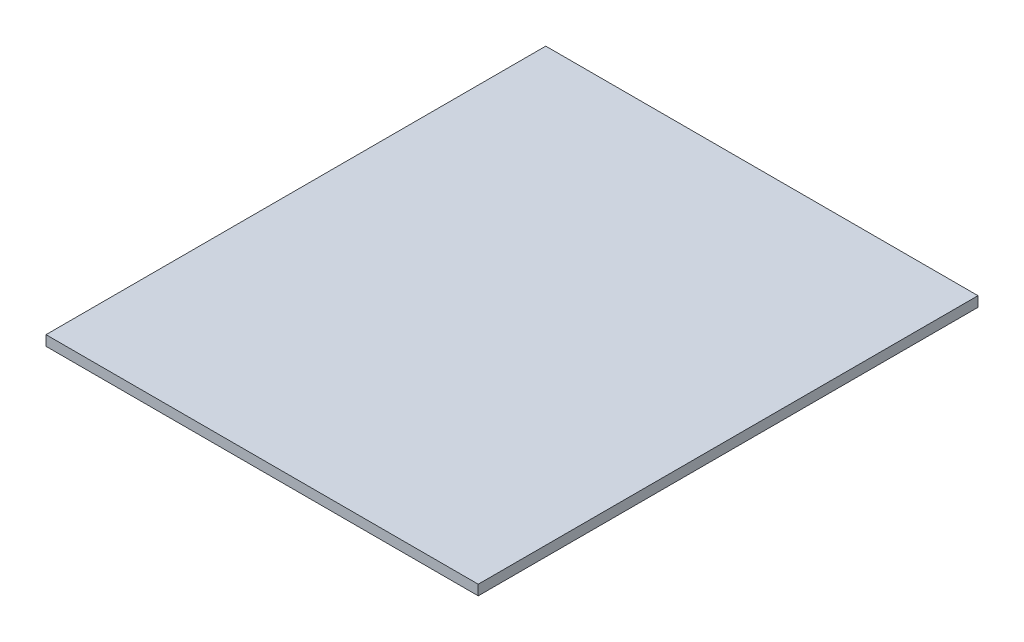
ISO-10303-21;
HEADER;
FILE_DESCRIPTION(('STEP AP214'),'2;1');
FILE_NAME('part.step','',(''),(''),'','','');
FILE_SCHEMA(('AUTOMOTIVE_DESIGN { 1 0 10303 214 1 1 1 1 }'));
ENDSEC;
DATA;
#1=APPLICATION_CONTEXT('core data for automotive mechanical design processes');
#2=APPLICATION_PROTOCOL_DEFINITION('international standard','automotive_design',2000,#1);
#3=PRODUCT_CONTEXT('',#1,'mechanical');
#4=PRODUCT('Part','Part','',(#3));
#5=PRODUCT_RELATED_PRODUCT_CATEGORY('part','',(#4));
#6=PRODUCT_DEFINITION_FORMATION('','',#4);
#7=PRODUCT_DEFINITION_CONTEXT('part definition',#1,'design');
#8=PRODUCT_DEFINITION('design','',#6,#7);
#9=PRODUCT_DEFINITION_SHAPE('','',#8);
#10=(LENGTH_UNIT() NAMED_UNIT(*) SI_UNIT(.MILLI.,.METRE.));
#11=(NAMED_UNIT(*) PLANE_ANGLE_UNIT() SI_UNIT($,.RADIAN.));
#12=(NAMED_UNIT(*) SI_UNIT($,.STERADIAN.) SOLID_ANGLE_UNIT());
#13=UNCERTAINTY_MEASURE_WITH_UNIT(LENGTH_MEASURE(1.E-05),#10,'distance_accuracy_value','');
#14=(GEOMETRIC_REPRESENTATION_CONTEXT(3) GLOBAL_UNCERTAINTY_ASSIGNED_CONTEXT((#13)) GLOBAL_UNIT_ASSIGNED_CONTEXT((#10,
#11,#12)) REPRESENTATION_CONTEXT('',''));
#15=CARTESIAN_POINT('',(0.,0.,0.));
#16=DIRECTION('',(0.,0.,1.));
#17=DIRECTION('',(1.,0.,0.));
#18=AXIS2_PLACEMENT_3D('',#15,#16,#17);
#19=CARTESIAN_POINT('',(32.,1.5,-37.));
#20=DIRECTION('',(-1.,0.,0.));
#21=DIRECTION('',(0.,0.,1.));
#22=AXIS2_PLACEMENT_3D('',#19,#20,#21);
#23=PLANE('',#22);
#24=DIRECTION('',(0.,0.,-1.));
#25=VECTOR('',#24,1.);
#26=CARTESIAN_POINT('',(32.,0.,-37.));
#27=LINE('',#26,#25);
#28=CARTESIAN_POINT('',(32.,0.,37.));
#29=VERTEX_POINT('',#28);
#30=CARTESIAN_POINT('',(32.,0.,-37.));
#31=VERTEX_POINT('',#30);
#32=EDGE_CURVE('E99',#29,#31,#27,.T.);
#33=ORIENTED_EDGE('',*,*,#32,.T.);
#34=DIRECTION('',(0.,-1.,0.));
#35=VECTOR('',#34,1.);
#36=CARTESIAN_POINT('',(32.,1.5,-37.));
#37=LINE('',#36,#35);
#38=CARTESIAN_POINT('',(32.,1.5,-37.));
#39=VERTEX_POINT('',#38);
#40=EDGE_CURVE('E11',#39,#31,#37,.T.);
#41=ORIENTED_EDGE('',*,*,#40,.F.);
#42=DIRECTION('',(0.,0.,-1.));
#43=VECTOR('',#42,1.);
#44=CARTESIAN_POINT('',(32.,1.5,-37.));
#45=LINE('',#44,#43);
#46=CARTESIAN_POINT('',(32.,1.5,37.));
#47=VERTEX_POINT('',#46);
#48=EDGE_CURVE('E87',#47,#39,#45,.T.);
#49=ORIENTED_EDGE('',*,*,#48,.F.);
#50=DIRECTION('',(0.,-1.,0.));
#51=VECTOR('',#50,1.);
#52=CARTESIAN_POINT('',(32.,1.5,37.));
#53=LINE('',#52,#51);
#54=EDGE_CURVE('E95',#47,#29,#53,.T.);
#55=ORIENTED_EDGE('',*,*,#54,.T.);
#56=EDGE_LOOP('',(#33,#41,#49,#55));
#57=FACE_BOUND('',#56,.T.);
#58=ADVANCED_FACE('F36',(#57),#23,.F.);
#59=CARTESIAN_POINT('',(-32.,1.5,-37.));
#60=DIRECTION('',(0.,0.,1.));
#61=DIRECTION('',(1.,0.,0.));
#62=AXIS2_PLACEMENT_3D('',#59,#60,#61);
#63=PLANE('',#62);
#64=DIRECTION('',(-1.,0.,0.));
#65=VECTOR('',#64,1.);
#66=CARTESIAN_POINT('',(-32.,0.,-37.));
#67=LINE('',#66,#65);
#68=CARTESIAN_POINT('',(-32.,0.,-37.));
#69=VERTEX_POINT('',#68);
#70=EDGE_CURVE('E91',#31,#69,#67,.T.);
#71=ORIENTED_EDGE('',*,*,#70,.T.);
#72=DIRECTION('',(0.,-1.,0.));
#73=VECTOR('',#72,1.);
#74=CARTESIAN_POINT('',(-32.,1.5,-37.));
#75=LINE('',#74,#73);
#76=CARTESIAN_POINT('',(-32.,1.5,-37.));
#77=VERTEX_POINT('',#76);
#78=EDGE_CURVE('E44',#77,#69,#75,.T.);
#79=ORIENTED_EDGE('',*,*,#78,.F.);
#80=DIRECTION('',(-1.,0.,0.));
#81=VECTOR('',#80,1.);
#82=CARTESIAN_POINT('',(-32.,1.5,-37.));
#83=LINE('',#82,#81);
#84=EDGE_CURVE('E82',#39,#77,#83,.T.);
#85=ORIENTED_EDGE('',*,*,#84,.F.);
#86=ORIENTED_EDGE('',*,*,#40,.T.);
#87=EDGE_LOOP('',(#71,#79,#85,#86));
#88=FACE_BOUND('',#87,.T.);
#89=ADVANCED_FACE('F90',(#88),#63,.F.);
#90=CARTESIAN_POINT('',(-32.,1.5,-37.));
#91=DIRECTION('',(1.,0.,0.));
#92=DIRECTION('',(0.,0.,-1.));
#93=AXIS2_PLACEMENT_3D('',#90,#91,#92);
#94=PLANE('',#93);
#95=DIRECTION('',(0.,0.,1.));
#96=VECTOR('',#95,1.);
#97=CARTESIAN_POINT('',(-32.,0.,-37.));
#98=LINE('',#97,#96);
#99=CARTESIAN_POINT('',(-32.,0.,37.));
#100=VERTEX_POINT('',#99);
#101=EDGE_CURVE('E69',#69,#100,#98,.T.);
#102=ORIENTED_EDGE('',*,*,#101,.T.);
#103=DIRECTION('',(0.,-1.,0.));
#104=VECTOR('',#103,1.);
#105=CARTESIAN_POINT('',(-32.,1.5,37.));
#106=LINE('',#105,#104);
#107=CARTESIAN_POINT('',(-32.,1.5,37.));
#108=VERTEX_POINT('',#107);
#109=EDGE_CURVE('E92',#108,#100,#106,.T.);
#110=ORIENTED_EDGE('',*,*,#109,.F.);
#111=DIRECTION('',(0.,0.,1.));
#112=VECTOR('',#111,1.);
#113=CARTESIAN_POINT('',(-32.,1.5,-37.));
#114=LINE('',#113,#112);
#115=EDGE_CURVE('E85',#77,#108,#114,.T.);
#116=ORIENTED_EDGE('',*,*,#115,.F.);
#117=ORIENTED_EDGE('',*,*,#78,.T.);
#118=EDGE_LOOP('',(#102,#110,#116,#117));
#119=FACE_BOUND('',#118,.T.);
#120=ADVANCED_FACE('F93',(#119),#94,.F.);
#121=CARTESIAN_POINT('',(-32.,1.5,37.));
#122=DIRECTION('',(0.,0.,-1.));
#123=DIRECTION('',(-1.,0.,0.));
#124=AXIS2_PLACEMENT_3D('',#121,#122,#123);
#125=PLANE('',#124);
#126=DIRECTION('',(1.,0.,0.));
#127=VECTOR('',#126,1.);
#128=CARTESIAN_POINT('',(-32.,0.,37.));
#129=LINE('',#128,#127);
#130=EDGE_CURVE('E75',#100,#29,#129,.T.);
#131=ORIENTED_EDGE('',*,*,#130,.T.);
#132=ORIENTED_EDGE('',*,*,#54,.F.);
#133=DIRECTION('',(1.,0.,0.));
#134=VECTOR('',#133,1.);
#135=CARTESIAN_POINT('',(-32.,1.5,37.));
#136=LINE('',#135,#134);
#137=EDGE_CURVE('E52',#108,#47,#136,.T.);
#138=ORIENTED_EDGE('',*,*,#137,.F.);
#139=ORIENTED_EDGE('',*,*,#109,.T.);
#140=EDGE_LOOP('',(#131,#132,#138,#139));
#141=FACE_BOUND('',#140,.T.);
#142=ADVANCED_FACE('F106',(#141),#125,.F.);
#143=CARTESIAN_POINT('',(0.,1.5,0.));
#144=DIRECTION('',(0.,1.,0.));
#145=DIRECTION('',(0.,0.,1.));
#146=AXIS2_PLACEMENT_3D('',#143,#144,#145);
#147=PLANE('',#146);
#148=ORIENTED_EDGE('',*,*,#48,.T.);
#149=ORIENTED_EDGE('',*,*,#84,.T.);
#150=ORIENTED_EDGE('',*,*,#115,.T.);
#151=ORIENTED_EDGE('',*,*,#137,.T.);
#152=EDGE_LOOP('',(#148,#149,#150,#151));
#153=FACE_BOUND('',#152,.T.);
#154=ADVANCED_FACE('F83',(#153),#147,.T.);
#155=CARTESIAN_POINT('',(0.,0.,0.));
#156=DIRECTION('',(0.,1.,0.));
#157=DIRECTION('',(0.,0.,1.));
#158=AXIS2_PLACEMENT_3D('',#155,#156,#157);
#159=PLANE('',#158);
#160=ORIENTED_EDGE('',*,*,#32,.F.);
#161=ORIENTED_EDGE('',*,*,#130,.F.);
#162=ORIENTED_EDGE('',*,*,#101,.F.);
#163=ORIENTED_EDGE('',*,*,#70,.F.);
#164=EDGE_LOOP('',(#160,#161,#162,#163));
#165=FACE_BOUND('',#164,.T.);
#166=ADVANCED_FACE('F109',(#165),#159,.F.);
#167=CLOSED_SHELL('',(#58,#89,#120,#142,#154,#166));
#168=MANIFOLD_SOLID_BREP('B2',#167);
#169=ADVANCED_BREP_SHAPE_REPRESENTATION('',(#18,#168),#14);
#170=SHAPE_DEFINITION_REPRESENTATION(#9,#169);
ENDSEC;
END-ISO-10303-21;
